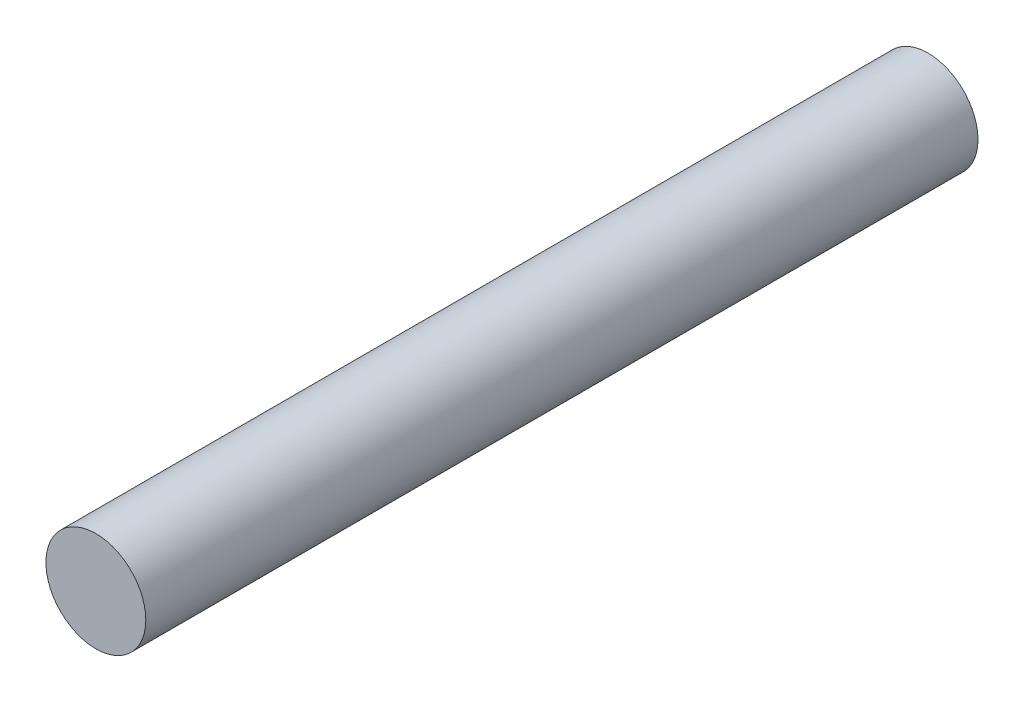
ISO-10303-21;
HEADER;
FILE_DESCRIPTION(('STEP AP214'),'2;1');
FILE_NAME('part.step','',(''),(''),'','','');
FILE_SCHEMA(('AUTOMOTIVE_DESIGN { 1 0 10303 214 1 1 1 1 }'));
ENDSEC;
DATA;
#1=APPLICATION_CONTEXT('core data for automotive mechanical design processes');
#2=APPLICATION_PROTOCOL_DEFINITION('international standard','automotive_design',2000,#1);
#3=PRODUCT_CONTEXT('',#1,'mechanical');
#4=PRODUCT('Part','Part','',(#3));
#5=PRODUCT_RELATED_PRODUCT_CATEGORY('part','',(#4));
#6=PRODUCT_DEFINITION_FORMATION('','',#4);
#7=PRODUCT_DEFINITION_CONTEXT('part definition',#1,'design');
#8=PRODUCT_DEFINITION('design','',#6,#7);
#9=PRODUCT_DEFINITION_SHAPE('','',#8);
#10=(LENGTH_UNIT() NAMED_UNIT(*) SI_UNIT(.MILLI.,.METRE.));
#11=(NAMED_UNIT(*) PLANE_ANGLE_UNIT() SI_UNIT($,.RADIAN.));
#12=(NAMED_UNIT(*) SI_UNIT($,.STERADIAN.) SOLID_ANGLE_UNIT());
#13=UNCERTAINTY_MEASURE_WITH_UNIT(LENGTH_MEASURE(1.E-05),#10,'distance_accuracy_value','');
#14=(GEOMETRIC_REPRESENTATION_CONTEXT(3) GLOBAL_UNCERTAINTY_ASSIGNED_CONTEXT((#13)) GLOBAL_UNIT_ASSIGNED_CONTEXT((#10,
#11,#12)) REPRESENTATION_CONTEXT('',''));
#15=CARTESIAN_POINT('',(0.,0.,0.));
#16=DIRECTION('',(0.,0.,1.));
#17=DIRECTION('',(1.,0.,0.));
#18=AXIS2_PLACEMENT_3D('',#15,#16,#17);
#19=CARTESIAN_POINT('',(0.,0.,50.));
#20=DIRECTION('',(0.,0.,-1.));
#21=DIRECTION('',(-1.,0.,0.));
#22=AXIS2_PLACEMENT_3D('',#19,#20,#21);
#23=CYLINDRICAL_SURFACE('',#22,3.);
#24=CARTESIAN_POINT('',(0.,0.,50.));
#25=DIRECTION('',(0.,0.,1.));
#26=DIRECTION('',(1.,0.,0.));
#27=AXIS2_PLACEMENT_3D('',#24,#25,#26);
#28=CIRCLE('',#27,3.);
#29=CARTESIAN_POINT('',(3.,0.,50.));
#30=VERTEX_POINT('',#29);
#31=EDGE_CURVE('E10',#30,#30,#28,.T.);
#32=ORIENTED_EDGE('',*,*,#31,.F.);
#33=EDGE_LOOP('',(#32));
#34=FACE_BOUND('',#33,.T.);
#35=CARTESIAN_POINT('',(0.,0.,0.));
#36=DIRECTION('',(0.,0.,1.));
#37=DIRECTION('',(1.,0.,0.));
#38=AXIS2_PLACEMENT_3D('',#35,#36,#37);
#39=CIRCLE('',#38,3.);
#40=CARTESIAN_POINT('',(3.,0.,0.));
#41=VERTEX_POINT('',#40);
#42=EDGE_CURVE('E35',#41,#41,#39,.T.);
#43=ORIENTED_EDGE('',*,*,#42,.T.);
#44=EDGE_LOOP('',(#43));
#45=FACE_BOUND('',#44,.T.);
#46=ADVANCED_FACE('F32',(#34,#45),#23,.T.);
#47=CARTESIAN_POINT('',(0.,0.,50.));
#48=DIRECTION('',(0.,0.,1.));
#49=DIRECTION('',(1.,0.,0.));
#50=AXIS2_PLACEMENT_3D('',#47,#48,#49);
#51=PLANE('',#50);
#52=ORIENTED_EDGE('',*,*,#31,.T.);
#53=EDGE_LOOP('',(#52));
#54=FACE_BOUND('',#53,.T.);
#55=ADVANCED_FACE('F47',(#54),#51,.T.);
#56=CARTESIAN_POINT('',(0.,0.,0.));
#57=DIRECTION('',(0.,0.,1.));
#58=DIRECTION('',(1.,0.,0.));
#59=AXIS2_PLACEMENT_3D('',#56,#57,#58);
#60=PLANE('',#59);
#61=ORIENTED_EDGE('',*,*,#42,.F.);
#62=EDGE_LOOP('',(#61));
#63=FACE_BOUND('',#62,.T.);
#64=ADVANCED_FACE('F45',(#63),#60,.F.);
#65=CLOSED_SHELL('',(#46,#55,#64));
#66=MANIFOLD_SOLID_BREP('B2',#65);
#67=ADVANCED_BREP_SHAPE_REPRESENTATION('',(#18,#66),#14);
#68=SHAPE_DEFINITION_REPRESENTATION(#9,#67);
ENDSEC;
END-ISO-10303-21;
